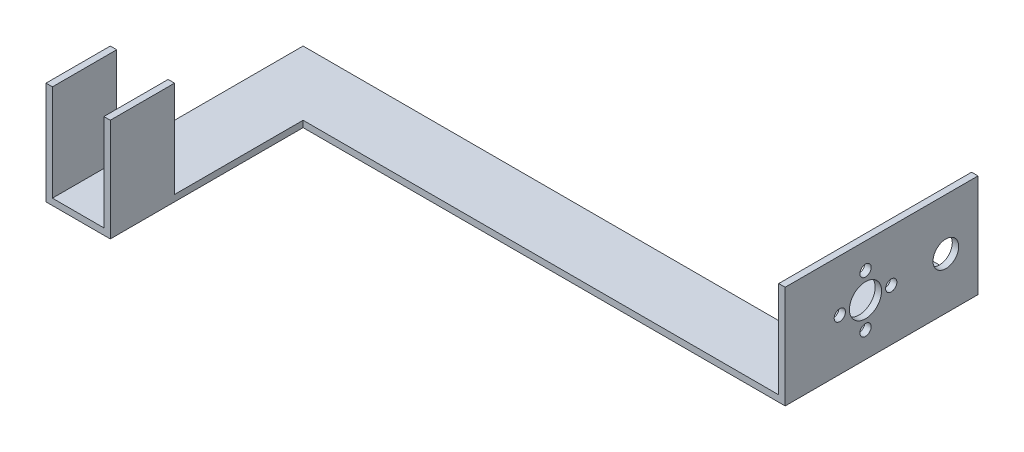
ISO-10303-21;
HEADER;
FILE_DESCRIPTION(('STEP AP214'),'2;1');
FILE_NAME('part.step','',(''),(''),'','','');
FILE_SCHEMA(('AUTOMOTIVE_DESIGN { 1 0 10303 214 1 1 1 1 }'));
ENDSEC;
DATA;
#1=APPLICATION_CONTEXT('core data for automotive mechanical design processes');
#2=APPLICATION_PROTOCOL_DEFINITION('international standard','automotive_design',2000,#1);
#3=PRODUCT_CONTEXT('',#1,'mechanical');
#4=PRODUCT('Part','Part','',(#3));
#5=PRODUCT_RELATED_PRODUCT_CATEGORY('part','',(#4));
#6=PRODUCT_DEFINITION_FORMATION('','',#4);
#7=PRODUCT_DEFINITION_CONTEXT('part definition',#1,'design');
#8=PRODUCT_DEFINITION('design','',#6,#7);
#9=PRODUCT_DEFINITION_SHAPE('','',#8);
#10=(LENGTH_UNIT() NAMED_UNIT(*) SI_UNIT(.MILLI.,.METRE.));
#11=(NAMED_UNIT(*) PLANE_ANGLE_UNIT() SI_UNIT($,.RADIAN.));
#12=(NAMED_UNIT(*) SI_UNIT($,.STERADIAN.) SOLID_ANGLE_UNIT());
#13=UNCERTAINTY_MEASURE_WITH_UNIT(LENGTH_MEASURE(1.E-05),#10,'distance_accuracy_value','');
#14=(GEOMETRIC_REPRESENTATION_CONTEXT(3) GLOBAL_UNCERTAINTY_ASSIGNED_CONTEXT((#13)) GLOBAL_UNIT_ASSIGNED_CONTEXT((#10,
#11,#12)) REPRESENTATION_CONTEXT('',''));
#15=CARTESIAN_POINT('',(0.,0.,0.));
#16=DIRECTION('',(0.,0.,1.));
#17=DIRECTION('',(1.,0.,0.));
#18=AXIS2_PLACEMENT_3D('',#15,#16,#17);
#19=CARTESIAN_POINT('',(0.,2.,0.));
#20=DIRECTION('',(0.,1.,0.));
#21=DIRECTION('',(0.,0.,1.));
#22=AXIS2_PLACEMENT_3D('',#19,#20,#21);
#23=PLANE('',#22);
#24=DIRECTION('',(1.,0.,0.));
#25=VECTOR('',#24,1.);
#26=CARTESIAN_POINT('',(150.,2.,-60.));
#27=LINE('',#26,#25);
#28=CARTESIAN_POINT('',(0.,2.,-60.));
#29=VERTEX_POINT('',#28);
#30=CARTESIAN_POINT('',(148.,2.,-60.));
#31=VERTEX_POINT('',#30);
#32=EDGE_CURVE('E48',#29,#31,#27,.T.);
#33=ORIENTED_EDGE('',*,*,#32,.T.);
#34=DIRECTION('',(0.,0.,1.));
#35=VECTOR('',#34,1.);
#36=CARTESIAN_POINT('',(148.,2.,-120.));
#37=LINE('',#36,#35);
#38=CARTESIAN_POINT('',(148.,2.,-120.));
#39=VERTEX_POINT('',#38);
#40=EDGE_CURVE('E168',#39,#31,#37,.T.);
#41=ORIENTED_EDGE('',*,*,#40,.F.);
#42=DIRECTION('',(-1.,0.,0.));
#43=VECTOR('',#42,1.);
#44=CARTESIAN_POINT('',(130.,2.,-120.));
#45=LINE('',#44,#43);
#46=CARTESIAN_POINT('',(130.,2.,-120.));
#47=VERTEX_POINT('',#46);
#48=EDGE_CURVE('E229',#39,#47,#45,.T.);
#49=ORIENTED_EDGE('',*,*,#48,.T.);
#50=DIRECTION('',(0.,0.,1.));
#51=VECTOR('',#50,1.);
#52=CARTESIAN_POINT('',(130.,2.,-80.));
#53=LINE('',#52,#51);
#54=CARTESIAN_POINT('',(130.,2.,-80.));
#55=VERTEX_POINT('',#54);
#56=EDGE_CURVE('E232',#47,#55,#53,.T.);
#57=ORIENTED_EDGE('',*,*,#56,.T.);
#58=DIRECTION('',(-1.,0.,0.));
#59=VECTOR('',#58,1.);
#60=CARTESIAN_POINT('',(-20.,2.,-80.));
#61=LINE('',#60,#59);
#62=CARTESIAN_POINT('',(-20.,2.,-80.));
#63=VERTEX_POINT('',#62);
#64=EDGE_CURVE('E234',#55,#63,#61,.T.);
#65=ORIENTED_EDGE('',*,*,#64,.T.);
#66=DIRECTION('',(0.,0.,1.));
#67=VECTOR('',#66,1.);
#68=CARTESIAN_POINT('',(-20.,2.,0.));
#69=LINE('',#68,#67);
#70=CARTESIAN_POINT('',(-20.,2.,-20.));
#71=VERTEX_POINT('',#70);
#72=EDGE_CURVE('E236',#63,#71,#69,.T.);
#73=ORIENTED_EDGE('',*,*,#72,.T.);
#74=DIRECTION('',(-1.,0.,0.));
#75=VECTOR('',#74,1.);
#76=CARTESIAN_POINT('',(-20.,2.,-20.));
#77=LINE('',#76,#75);
#78=CARTESIAN_POINT('',(-18.,2.,-20.));
#79=VERTEX_POINT('',#78);
#80=EDGE_CURVE('E208',#79,#71,#77,.T.);
#81=ORIENTED_EDGE('',*,*,#80,.F.);
#82=DIRECTION('',(0.,0.,-1.));
#83=VECTOR('',#82,1.);
#84=CARTESIAN_POINT('',(-18.,2.,-20.));
#85=LINE('',#84,#83);
#86=CARTESIAN_POINT('',(-18.,2.,0.));
#87=VERTEX_POINT('',#86);
#88=EDGE_CURVE('E203',#87,#79,#85,.T.);
#89=ORIENTED_EDGE('',*,*,#88,.F.);
#90=DIRECTION('',(1.,0.,0.));
#91=VECTOR('',#90,1.);
#92=CARTESIAN_POINT('',(0.,2.,0.));
#93=LINE('',#92,#91);
#94=CARTESIAN_POINT('',(-2.,2.,0.));
#95=VERTEX_POINT('',#94);
#96=EDGE_CURVE('E238',#87,#95,#93,.T.);
#97=ORIENTED_EDGE('',*,*,#96,.T.);
#98=DIRECTION('',(0.,0.,1.));
#99=VECTOR('',#98,1.);
#100=CARTESIAN_POINT('',(-2.,2.,-20.));
#101=LINE('',#100,#99);
#102=CARTESIAN_POINT('',(-2.,2.,-20.));
#103=VERTEX_POINT('',#102);
#104=EDGE_CURVE('E182',#103,#95,#101,.T.);
#105=ORIENTED_EDGE('',*,*,#104,.F.);
#106=DIRECTION('',(-1.,0.,0.));
#107=VECTOR('',#106,1.);
#108=CARTESIAN_POINT('',(0.,2.,-20.));
#109=LINE('',#108,#107);
#110=CARTESIAN_POINT('',(0.,2.,-20.));
#111=VERTEX_POINT('',#110);
#112=EDGE_CURVE('E187',#111,#103,#109,.T.);
#113=ORIENTED_EDGE('',*,*,#112,.F.);
#114=DIRECTION('',(0.,0.,-1.));
#115=VECTOR('',#114,1.);
#116=CARTESIAN_POINT('',(0.,2.,-60.));
#117=LINE('',#116,#115);
#118=EDGE_CURVE('E241',#111,#29,#117,.T.);
#119=ORIENTED_EDGE('',*,*,#118,.T.);
#120=EDGE_LOOP('',(#33,#41,#49,#57,#65,#73,#81,#89,#97,#105,#113,#119));
#121=FACE_BOUND('',#120,.T.);
#122=ADVANCED_FACE('F33',(#121),#23,.T.);
#123=CARTESIAN_POINT('',(150.,2.,-60.));
#124=DIRECTION('',(0.,0.,-1.));
#125=DIRECTION('',(-1.,0.,0.));
#126=AXIS2_PLACEMENT_3D('',#123,#124,#125);
#127=PLANE('',#126);
#128=DIRECTION('',(1.,0.,0.));
#129=VECTOR('',#128,1.);
#130=CARTESIAN_POINT('',(150.,0.,-60.));
#131=LINE('',#130,#129);
#132=CARTESIAN_POINT('',(0.,0.,-60.));
#133=VERTEX_POINT('',#132);
#134=CARTESIAN_POINT('',(150.,0.,-60.));
#135=VERTEX_POINT('',#134);
#136=EDGE_CURVE('E154',#133,#135,#131,.T.);
#137=ORIENTED_EDGE('',*,*,#136,.T.);
#138=DIRECTION('',(0.,-1.,0.));
#139=VECTOR('',#138,1.);
#140=CARTESIAN_POINT('',(150.,2.,-60.));
#141=LINE('',#140,#139);
#142=CARTESIAN_POINT('',(150.,32.,-60.));
#143=VERTEX_POINT('',#142);
#144=EDGE_CURVE('E11',#143,#135,#141,.T.);
#145=ORIENTED_EDGE('',*,*,#144,.F.);
#146=DIRECTION('',(1.,0.,0.));
#147=VECTOR('',#146,1.);
#148=CARTESIAN_POINT('',(148.,32.,-60.));
#149=LINE('',#148,#147);
#150=CARTESIAN_POINT('',(148.,32.,-60.));
#151=VERTEX_POINT('',#150);
#152=EDGE_CURVE('E151',#151,#143,#149,.T.);
#153=ORIENTED_EDGE('',*,*,#152,.F.);
#154=DIRECTION('',(0.,-1.,0.));
#155=VECTOR('',#154,1.);
#156=CARTESIAN_POINT('',(148.,32.,-60.));
#157=LINE('',#156,#155);
#158=EDGE_CURVE('E176',#151,#31,#157,.T.);
#159=ORIENTED_EDGE('',*,*,#158,.T.);
#160=ORIENTED_EDGE('',*,*,#32,.F.);
#161=DIRECTION('',(0.,-1.,0.));
#162=VECTOR('',#161,1.);
#163=CARTESIAN_POINT('',(0.,2.,-60.));
#164=LINE('',#163,#162);
#165=EDGE_CURVE('E243',#29,#133,#164,.T.);
#166=ORIENTED_EDGE('',*,*,#165,.T.);
#167=EDGE_LOOP('',(#137,#145,#153,#159,#160,#166));
#168=FACE_BOUND('',#167,.T.);
#169=ADVANCED_FACE('F35',(#168),#127,.F.);
#170=CARTESIAN_POINT('',(150.,2.,-120.));
#171=DIRECTION('',(-1.,0.,0.));
#172=DIRECTION('',(0.,0.,1.));
#173=AXIS2_PLACEMENT_3D('',#170,#171,#172);
#174=PLANE('',#173);
#175=CARTESIAN_POINT('',(150.,16.,-110.));
#176=DIRECTION('',(1.,0.,0.));
#177=DIRECTION('',(0.,0.,-1.));
#178=AXIS2_PLACEMENT_3D('',#175,#176,#177);
#179=CIRCLE('',#178,4.00000000000001);
#180=CARTESIAN_POINT('',(150.,16.,-114.));
#181=VERTEX_POINT('',#180);
#182=EDGE_CURVE('E360',#181,#181,#179,.T.);
#183=ORIENTED_EDGE('',*,*,#182,.F.);
#184=EDGE_LOOP('',(#183));
#185=FACE_BOUND('',#184,.T.);
#186=CARTESIAN_POINT('',(150.,24.,-85.));
#187=DIRECTION('',(1.,0.,0.));
#188=DIRECTION('',(0.,0.,-1.));
#189=AXIS2_PLACEMENT_3D('',#186,#187,#188);
#190=CIRCLE('',#189,1.75);
#191=CARTESIAN_POINT('',(150.,24.,-86.75));
#192=VERTEX_POINT('',#191);
#193=EDGE_CURVE('E364',#192,#192,#190,.T.);
#194=ORIENTED_EDGE('',*,*,#193,.F.);
#195=EDGE_LOOP('',(#194));
#196=FACE_BOUND('',#195,.T.);
#197=CARTESIAN_POINT('',(150.,16.,-93.));
#198=DIRECTION('',(1.,0.,0.));
#199=DIRECTION('',(0.,0.,-1.));
#200=AXIS2_PLACEMENT_3D('',#197,#198,#199);
#201=CIRCLE('',#200,1.75);
#202=CARTESIAN_POINT('',(150.,16.,-94.75));
#203=VERTEX_POINT('',#202);
#204=EDGE_CURVE('E368',#203,#203,#201,.T.);
#205=ORIENTED_EDGE('',*,*,#204,.F.);
#206=EDGE_LOOP('',(#205));
#207=FACE_BOUND('',#206,.T.);
#208=CARTESIAN_POINT('',(150.,7.99999999999999,-85.));
#209=DIRECTION('',(1.,0.,0.));
#210=DIRECTION('',(0.,0.,-1.));
#211=AXIS2_PLACEMENT_3D('',#208,#209,#210);
#212=CIRCLE('',#211,1.74999999999998);
#213=CARTESIAN_POINT('',(150.,7.99999999999999,-86.75));
#214=VERTEX_POINT('',#213);
#215=EDGE_CURVE('E372',#214,#214,#212,.T.);
#216=ORIENTED_EDGE('',*,*,#215,.F.);
#217=EDGE_LOOP('',(#216));
#218=FACE_BOUND('',#217,.T.);
#219=CARTESIAN_POINT('',(150.,16.,-77.));
#220=DIRECTION('',(1.,0.,0.));
#221=DIRECTION('',(0.,0.,-1.));
#222=AXIS2_PLACEMENT_3D('',#219,#220,#221);
#223=CIRCLE('',#222,1.74999999999997);
#224=CARTESIAN_POINT('',(150.,16.,-78.75));
#225=VERTEX_POINT('',#224);
#226=EDGE_CURVE('E376',#225,#225,#223,.T.);
#227=ORIENTED_EDGE('',*,*,#226,.F.);
#228=EDGE_LOOP('',(#227));
#229=FACE_BOUND('',#228,.T.);
#230=CARTESIAN_POINT('',(150.,16.,-85.));
#231=DIRECTION('',(1.,0.,0.));
#232=DIRECTION('',(0.,0.,-1.));
#233=AXIS2_PLACEMENT_3D('',#230,#231,#232);
#234=CIRCLE('',#233,5.);
#235=CARTESIAN_POINT('',(150.,16.,-90.));
#236=VERTEX_POINT('',#235);
#237=EDGE_CURVE('E379',#236,#236,#234,.T.);
#238=ORIENTED_EDGE('',*,*,#237,.F.);
#239=EDGE_LOOP('',(#238));
#240=FACE_BOUND('',#239,.T.);
#241=DIRECTION('',(0.,0.,-1.));
#242=VECTOR('',#241,1.);
#243=CARTESIAN_POINT('',(150.,0.,-120.));
#244=LINE('',#243,#242);
#245=CARTESIAN_POINT('',(150.,0.,-120.));
#246=VERTEX_POINT('',#245);
#247=EDGE_CURVE('E245',#135,#246,#244,.T.);
#248=ORIENTED_EDGE('',*,*,#247,.T.);
#249=DIRECTION('',(0.,-1.,0.));
#250=VECTOR('',#249,1.);
#251=CARTESIAN_POINT('',(150.,2.,-120.));
#252=LINE('',#251,#250);
#253=CARTESIAN_POINT('',(150.,32.,-120.));
#254=VERTEX_POINT('',#253);
#255=EDGE_CURVE('E41',#254,#246,#252,.T.);
#256=ORIENTED_EDGE('',*,*,#255,.F.);
#257=DIRECTION('',(0.,0.,-1.));
#258=VECTOR('',#257,1.);
#259=CARTESIAN_POINT('',(150.,32.,-60.));
#260=LINE('',#259,#258);
#261=EDGE_CURVE('E157',#143,#254,#260,.T.);
#262=ORIENTED_EDGE('',*,*,#261,.F.);
#263=ORIENTED_EDGE('',*,*,#144,.T.);
#264=EDGE_LOOP('',(#248,#256,#262,#263));
#265=FACE_BOUND('',#264,.T.);
#266=ADVANCED_FACE('F158',(#185,#196,#207,#218,#229,#240,#265),#174,.F.);
#267=CARTESIAN_POINT('',(130.,2.,-120.));
#268=DIRECTION('',(0.,0.,1.));
#269=DIRECTION('',(1.,0.,0.));
#270=AXIS2_PLACEMENT_3D('',#267,#268,#269);
#271=PLANE('',#270);
#272=DIRECTION('',(-1.,0.,0.));
#273=VECTOR('',#272,1.);
#274=CARTESIAN_POINT('',(130.,0.,-120.));
#275=LINE('',#274,#273);
#276=CARTESIAN_POINT('',(130.,0.,-120.));
#277=VERTEX_POINT('',#276);
#278=EDGE_CURVE('E247',#246,#277,#275,.T.);
#279=ORIENTED_EDGE('',*,*,#278,.T.);
#280=DIRECTION('',(0.,-1.,0.));
#281=VECTOR('',#280,1.);
#282=CARTESIAN_POINT('',(130.,2.,-120.));
#283=LINE('',#282,#281);
#284=EDGE_CURVE('E271',#47,#277,#283,.T.);
#285=ORIENTED_EDGE('',*,*,#284,.F.);
#286=ORIENTED_EDGE('',*,*,#48,.F.);
#287=DIRECTION('',(0.,-1.,0.));
#288=VECTOR('',#287,1.);
#289=CARTESIAN_POINT('',(148.,32.,-120.));
#290=LINE('',#289,#288);
#291=CARTESIAN_POINT('',(148.,32.,-120.));
#292=VERTEX_POINT('',#291);
#293=EDGE_CURVE('E179',#292,#39,#290,.T.);
#294=ORIENTED_EDGE('',*,*,#293,.F.);
#295=DIRECTION('',(-1.,0.,0.));
#296=VECTOR('',#295,1.);
#297=CARTESIAN_POINT('',(150.,32.,-120.));
#298=LINE('',#297,#296);
#299=EDGE_CURVE('E162',#254,#292,#298,.T.);
#300=ORIENTED_EDGE('',*,*,#299,.F.);
#301=ORIENTED_EDGE('',*,*,#255,.T.);
#302=EDGE_LOOP('',(#279,#285,#286,#294,#300,#301));
#303=FACE_BOUND('',#302,.T.);
#304=ADVANCED_FACE('F275',(#303),#271,.F.);
#305=CARTESIAN_POINT('',(130.,2.,-80.));
#306=DIRECTION('',(1.,0.,0.));
#307=DIRECTION('',(0.,0.,-1.));
#308=AXIS2_PLACEMENT_3D('',#305,#306,#307);
#309=PLANE('',#308);
#310=DIRECTION('',(0.,0.,1.));
#311=VECTOR('',#310,1.);
#312=CARTESIAN_POINT('',(130.,0.,-80.));
#313=LINE('',#312,#311);
#314=CARTESIAN_POINT('',(130.,0.,-80.));
#315=VERTEX_POINT('',#314);
#316=EDGE_CURVE('E249',#277,#315,#313,.T.);
#317=ORIENTED_EDGE('',*,*,#316,.T.);
#318=DIRECTION('',(0.,-1.,0.));
#319=VECTOR('',#318,1.);
#320=CARTESIAN_POINT('',(130.,2.,-80.));
#321=LINE('',#320,#319);
#322=EDGE_CURVE('E268',#55,#315,#321,.T.);
#323=ORIENTED_EDGE('',*,*,#322,.F.);
#324=ORIENTED_EDGE('',*,*,#56,.F.);
#325=ORIENTED_EDGE('',*,*,#284,.T.);
#326=EDGE_LOOP('',(#317,#323,#324,#325));
#327=FACE_BOUND('',#326,.T.);
#328=ADVANCED_FACE('F285',(#327),#309,.F.);
#329=CARTESIAN_POINT('',(-20.,2.,-80.));
#330=DIRECTION('',(0.,0.,1.));
#331=DIRECTION('',(1.,0.,0.));
#332=AXIS2_PLACEMENT_3D('',#329,#330,#331);
#333=PLANE('',#332);
#334=DIRECTION('',(-1.,0.,0.));
#335=VECTOR('',#334,1.);
#336=CARTESIAN_POINT('',(-20.,0.,-80.));
#337=LINE('',#336,#335);
#338=CARTESIAN_POINT('',(-20.,0.,-80.));
#339=VERTEX_POINT('',#338);
#340=EDGE_CURVE('E251',#315,#339,#337,.T.);
#341=ORIENTED_EDGE('',*,*,#340,.T.);
#342=DIRECTION('',(0.,-1.,0.));
#343=VECTOR('',#342,1.);
#344=CARTESIAN_POINT('',(-20.,2.,-80.));
#345=LINE('',#344,#343);
#346=EDGE_CURVE('E265',#63,#339,#345,.T.);
#347=ORIENTED_EDGE('',*,*,#346,.F.);
#348=ORIENTED_EDGE('',*,*,#64,.F.);
#349=ORIENTED_EDGE('',*,*,#322,.T.);
#350=EDGE_LOOP('',(#341,#347,#348,#349));
#351=FACE_BOUND('',#350,.T.);
#352=ADVANCED_FACE('F289',(#351),#333,.F.);
#353=CARTESIAN_POINT('',(-20.,2.,0.));
#354=DIRECTION('',(1.,0.,0.));
#355=DIRECTION('',(0.,0.,-1.));
#356=AXIS2_PLACEMENT_3D('',#353,#354,#355);
#357=PLANE('',#356);
#358=DIRECTION('',(0.,0.,1.));
#359=VECTOR('',#358,1.);
#360=CARTESIAN_POINT('',(-20.,0.,0.));
#361=LINE('',#360,#359);
#362=CARTESIAN_POINT('',(-20.,0.,0.));
#363=VERTEX_POINT('',#362);
#364=EDGE_CURVE('E253',#339,#363,#361,.T.);
#365=ORIENTED_EDGE('',*,*,#364,.T.);
#366=DIRECTION('',(0.,-1.,0.));
#367=VECTOR('',#366,1.);
#368=CARTESIAN_POINT('',(-20.,2.,0.));
#369=LINE('',#368,#367);
#370=CARTESIAN_POINT('',(-20.,32.,0.));
#371=VERTEX_POINT('',#370);
#372=EDGE_CURVE('E262',#371,#363,#369,.T.);
#373=ORIENTED_EDGE('',*,*,#372,.F.);
#374=DIRECTION('',(0.,0.,1.));
#375=VECTOR('',#374,1.);
#376=CARTESIAN_POINT('',(-20.,32.,0.));
#377=LINE('',#376,#375);
#378=CARTESIAN_POINT('',(-20.,32.,-20.));
#379=VERTEX_POINT('',#378);
#380=EDGE_CURVE('E212',#379,#371,#377,.T.);
#381=ORIENTED_EDGE('',*,*,#380,.F.);
#382=DIRECTION('',(0.,-1.,0.));
#383=VECTOR('',#382,1.);
#384=CARTESIAN_POINT('',(-20.,32.,-20.));
#385=LINE('',#384,#383);
#386=EDGE_CURVE('E215',#379,#71,#385,.T.);
#387=ORIENTED_EDGE('',*,*,#386,.T.);
#388=ORIENTED_EDGE('',*,*,#72,.F.);
#389=ORIENTED_EDGE('',*,*,#346,.T.);
#390=EDGE_LOOP('',(#365,#373,#381,#387,#388,#389));
#391=FACE_BOUND('',#390,.T.);
#392=ADVANCED_FACE('F322',(#391),#357,.F.);
#393=CARTESIAN_POINT('',(0.,2.,0.));
#394=DIRECTION('',(0.,0.,-1.));
#395=DIRECTION('',(-1.,0.,0.));
#396=AXIS2_PLACEMENT_3D('',#393,#394,#395);
#397=PLANE('',#396);
#398=DIRECTION('',(1.,0.,0.));
#399=VECTOR('',#398,1.);
#400=CARTESIAN_POINT('',(0.,0.,0.));
#401=LINE('',#400,#399);
#402=CARTESIAN_POINT('',(0.,0.,0.));
#403=VERTEX_POINT('',#402);
#404=EDGE_CURVE('E255',#363,#403,#401,.T.);
#405=ORIENTED_EDGE('',*,*,#404,.T.);
#406=DIRECTION('',(0.,-1.,0.));
#407=VECTOR('',#406,1.);
#408=CARTESIAN_POINT('',(0.,2.,0.));
#409=LINE('',#408,#407);
#410=CARTESIAN_POINT('',(0.,32.,0.));
#411=VERTEX_POINT('',#410);
#412=EDGE_CURVE('E259',#411,#403,#409,.T.);
#413=ORIENTED_EDGE('',*,*,#412,.F.);
#414=DIRECTION('',(1.,0.,0.));
#415=VECTOR('',#414,1.);
#416=CARTESIAN_POINT('',(-2.,32.,0.));
#417=LINE('',#416,#415);
#418=CARTESIAN_POINT('',(-2.,32.,0.));
#419=VERTEX_POINT('',#418);
#420=EDGE_CURVE('E186',#419,#411,#417,.T.);
#421=ORIENTED_EDGE('',*,*,#420,.F.);
#422=DIRECTION('',(0.,-1.,0.));
#423=VECTOR('',#422,1.);
#424=CARTESIAN_POINT('',(-2.,32.,0.));
#425=LINE('',#424,#423);
#426=EDGE_CURVE('E201',#419,#95,#425,.T.);
#427=ORIENTED_EDGE('',*,*,#426,.T.);
#428=ORIENTED_EDGE('',*,*,#96,.F.);
#429=DIRECTION('',(0.,-1.,0.));
#430=VECTOR('',#429,1.);
#431=CARTESIAN_POINT('',(-18.,32.,0.));
#432=LINE('',#431,#430);
#433=CARTESIAN_POINT('',(-18.,32.,0.));
#434=VERTEX_POINT('',#433);
#435=EDGE_CURVE('E225',#434,#87,#432,.T.);
#436=ORIENTED_EDGE('',*,*,#435,.F.);
#437=DIRECTION('',(1.,0.,0.));
#438=VECTOR('',#437,1.);
#439=CARTESIAN_POINT('',(-18.,32.,0.));
#440=LINE('',#439,#438);
#441=EDGE_CURVE('E204',#371,#434,#440,.T.);
#442=ORIENTED_EDGE('',*,*,#441,.F.);
#443=ORIENTED_EDGE('',*,*,#372,.T.);
#444=EDGE_LOOP('',(#405,#413,#421,#427,#428,#436,#442,#443));
#445=FACE_BOUND('',#444,.T.);
#446=ADVANCED_FACE('F302',(#445),#397,.F.);
#447=CARTESIAN_POINT('',(0.,2.,-60.));
#448=DIRECTION('',(-1.,0.,0.));
#449=DIRECTION('',(0.,0.,1.));
#450=AXIS2_PLACEMENT_3D('',#447,#448,#449);
#451=PLANE('',#450);
#452=DIRECTION('',(0.,0.,-1.));
#453=VECTOR('',#452,1.);
#454=CARTESIAN_POINT('',(0.,0.,-60.));
#455=LINE('',#454,#453);
#456=EDGE_CURVE('E230',#403,#133,#455,.T.);
#457=ORIENTED_EDGE('',*,*,#456,.T.);
#458=ORIENTED_EDGE('',*,*,#165,.F.);
#459=ORIENTED_EDGE('',*,*,#118,.F.);
#460=DIRECTION('',(0.,-1.,0.));
#461=VECTOR('',#460,1.);
#462=CARTESIAN_POINT('',(0.,32.,-20.));
#463=LINE('',#462,#461);
#464=CARTESIAN_POINT('',(0.,32.,-20.));
#465=VERTEX_POINT('',#464);
#466=EDGE_CURVE('E56',#465,#111,#463,.T.);
#467=ORIENTED_EDGE('',*,*,#466,.F.);
#468=DIRECTION('',(0.,0.,-1.));
#469=VECTOR('',#468,1.);
#470=CARTESIAN_POINT('',(0.,32.,0.));
#471=LINE('',#470,#469);
#472=EDGE_CURVE('E190',#411,#465,#471,.T.);
#473=ORIENTED_EDGE('',*,*,#472,.F.);
#474=ORIENTED_EDGE('',*,*,#412,.T.);
#475=EDGE_LOOP('',(#457,#458,#459,#467,#473,#474));
#476=FACE_BOUND('',#475,.T.);
#477=ADVANCED_FACE('F299',(#476),#451,.F.);
#478=CARTESIAN_POINT('',(0.,0.,0.));
#479=DIRECTION('',(0.,1.,0.));
#480=DIRECTION('',(0.,0.,1.));
#481=AXIS2_PLACEMENT_3D('',#478,#479,#480);
#482=PLANE('',#481);
#483=ORIENTED_EDGE('',*,*,#136,.F.);
#484=ORIENTED_EDGE('',*,*,#456,.F.);
#485=ORIENTED_EDGE('',*,*,#404,.F.);
#486=ORIENTED_EDGE('',*,*,#364,.F.);
#487=ORIENTED_EDGE('',*,*,#340,.F.);
#488=ORIENTED_EDGE('',*,*,#316,.F.);
#489=ORIENTED_EDGE('',*,*,#278,.F.);
#490=ORIENTED_EDGE('',*,*,#247,.F.);
#491=EDGE_LOOP('',(#483,#484,#485,#486,#487,#488,#489,#490));
#492=FACE_BOUND('',#491,.T.);
#493=ADVANCED_FACE('F280',(#492),#482,.F.);
#494=CARTESIAN_POINT('',(-18.,32.,-20.));
#495=DIRECTION('',(-1.,0.,0.));
#496=DIRECTION('',(0.,0.,1.));
#497=AXIS2_PLACEMENT_3D('',#494,#495,#496);
#498=PLANE('',#497);
#499=ORIENTED_EDGE('',*,*,#88,.T.);
#500=DIRECTION('',(0.,-1.,0.));
#501=VECTOR('',#500,1.);
#502=CARTESIAN_POINT('',(-18.,32.,-20.));
#503=LINE('',#502,#501);
#504=CARTESIAN_POINT('',(-18.,32.,-20.));
#505=VERTEX_POINT('',#504);
#506=EDGE_CURVE('E222',#505,#79,#503,.T.);
#507=ORIENTED_EDGE('',*,*,#506,.F.);
#508=DIRECTION('',(0.,0.,-1.));
#509=VECTOR('',#508,1.);
#510=CARTESIAN_POINT('',(-18.,32.,-20.));
#511=LINE('',#510,#509);
#512=EDGE_CURVE('E207',#434,#505,#511,.T.);
#513=ORIENTED_EDGE('',*,*,#512,.F.);
#514=ORIENTED_EDGE('',*,*,#435,.T.);
#515=EDGE_LOOP('',(#499,#507,#513,#514));
#516=FACE_BOUND('',#515,.T.);
#517=ADVANCED_FACE('F315',(#516),#498,.F.);
#518=CARTESIAN_POINT('',(-20.,32.,-20.));
#519=DIRECTION('',(0.,0.,1.));
#520=DIRECTION('',(1.,0.,0.));
#521=AXIS2_PLACEMENT_3D('',#518,#519,#520);
#522=PLANE('',#521);
#523=ORIENTED_EDGE('',*,*,#80,.T.);
#524=ORIENTED_EDGE('',*,*,#386,.F.);
#525=DIRECTION('',(-1.,0.,0.));
#526=VECTOR('',#525,1.);
#527=CARTESIAN_POINT('',(-20.,32.,-20.));
#528=LINE('',#527,#526);
#529=EDGE_CURVE('E210',#505,#379,#528,.T.);
#530=ORIENTED_EDGE('',*,*,#529,.F.);
#531=ORIENTED_EDGE('',*,*,#506,.T.);
#532=EDGE_LOOP('',(#523,#524,#530,#531));
#533=FACE_BOUND('',#532,.T.);
#534=ADVANCED_FACE('F325',(#533),#522,.F.);
#535=CARTESIAN_POINT('',(0.,32.,0.));
#536=DIRECTION('',(0.,-1.,0.));
#537=DIRECTION('',(0.,0.,-1.));
#538=AXIS2_PLACEMENT_3D('',#535,#536,#537);
#539=PLANE('',#538);
#540=ORIENTED_EDGE('',*,*,#441,.T.);
#541=ORIENTED_EDGE('',*,*,#512,.T.);
#542=ORIENTED_EDGE('',*,*,#529,.T.);
#543=ORIENTED_EDGE('',*,*,#380,.T.);
#544=EDGE_LOOP('',(#540,#541,#542,#543));
#545=FACE_BOUND('',#544,.T.);
#546=ADVANCED_FACE('F319',(#545),#539,.F.);
#547=CARTESIAN_POINT('',(-2.,32.,-20.));
#548=DIRECTION('',(1.,0.,0.));
#549=DIRECTION('',(0.,0.,-1.));
#550=AXIS2_PLACEMENT_3D('',#547,#548,#549);
#551=PLANE('',#550);
#552=ORIENTED_EDGE('',*,*,#104,.T.);
#553=ORIENTED_EDGE('',*,*,#426,.F.);
#554=DIRECTION('',(0.,0.,1.));
#555=VECTOR('',#554,1.);
#556=CARTESIAN_POINT('',(-2.,32.,-20.));
#557=LINE('',#556,#555);
#558=CARTESIAN_POINT('',(-2.,32.,-20.));
#559=VERTEX_POINT('',#558);
#560=EDGE_CURVE('E183',#559,#419,#557,.T.);
#561=ORIENTED_EDGE('',*,*,#560,.F.);
#562=DIRECTION('',(0.,-1.,0.));
#563=VECTOR('',#562,1.);
#564=CARTESIAN_POINT('',(-2.,32.,-20.));
#565=LINE('',#564,#563);
#566=EDGE_CURVE('E194',#559,#103,#565,.T.);
#567=ORIENTED_EDGE('',*,*,#566,.T.);
#568=EDGE_LOOP('',(#552,#553,#561,#567));
#569=FACE_BOUND('',#568,.T.);
#570=ADVANCED_FACE('F309',(#569),#551,.F.);
#571=CARTESIAN_POINT('',(0.,32.,-20.));
#572=DIRECTION('',(0.,0.,1.));
#573=DIRECTION('',(1.,0.,0.));
#574=AXIS2_PLACEMENT_3D('',#571,#572,#573);
#575=PLANE('',#574);
#576=ORIENTED_EDGE('',*,*,#112,.T.);
#577=ORIENTED_EDGE('',*,*,#566,.F.);
#578=DIRECTION('',(-1.,0.,0.));
#579=VECTOR('',#578,1.);
#580=CARTESIAN_POINT('',(0.,32.,-20.));
#581=LINE('',#580,#579);
#582=EDGE_CURVE('E192',#465,#559,#581,.T.);
#583=ORIENTED_EDGE('',*,*,#582,.F.);
#584=ORIENTED_EDGE('',*,*,#466,.T.);
#585=EDGE_LOOP('',(#576,#577,#583,#584));
#586=FACE_BOUND('',#585,.T.);
#587=ADVANCED_FACE('F435',(#586),#575,.F.);
#588=CARTESIAN_POINT('',(0.,32.,0.));
#589=DIRECTION('',(0.,1.,0.));
#590=DIRECTION('',(0.,0.,1.));
#591=AXIS2_PLACEMENT_3D('',#588,#589,#590);
#592=PLANE('',#591);
#593=ORIENTED_EDGE('',*,*,#560,.T.);
#594=ORIENTED_EDGE('',*,*,#420,.T.);
#595=ORIENTED_EDGE('',*,*,#472,.T.);
#596=ORIENTED_EDGE('',*,*,#582,.T.);
#597=EDGE_LOOP('',(#593,#594,#595,#596));
#598=FACE_BOUND('',#597,.T.);
#599=ADVANCED_FACE('F304',(#598),#592,.T.);
#600=CARTESIAN_POINT('',(148.,32.,-120.));
#601=DIRECTION('',(1.,0.,0.));
#602=DIRECTION('',(0.,0.,-1.));
#603=AXIS2_PLACEMENT_3D('',#600,#601,#602);
#604=PLANE('',#603);
#605=CARTESIAN_POINT('',(148.,16.,-110.));
#606=DIRECTION('',(1.,0.,0.));
#607=DIRECTION('',(0.,0.,-1.));
#608=AXIS2_PLACEMENT_3D('',#605,#606,#607);
#609=CIRCLE('',#608,4.00000000000001);
#610=CARTESIAN_POINT('',(148.,16.,-114.));
#611=VERTEX_POINT('',#610);
#612=EDGE_CURVE('E386',#611,#611,#609,.F.);
#613=ORIENTED_EDGE('',*,*,#612,.F.);
#614=EDGE_LOOP('',(#613));
#615=FACE_BOUND('',#614,.T.);
#616=CARTESIAN_POINT('',(148.,24.,-85.));
#617=DIRECTION('',(1.,0.,0.));
#618=DIRECTION('',(0.,0.,-1.));
#619=AXIS2_PLACEMENT_3D('',#616,#617,#618);
#620=CIRCLE('',#619,1.75);
#621=CARTESIAN_POINT('',(148.,24.,-86.75));
#622=VERTEX_POINT('',#621);
#623=EDGE_CURVE('E381',#622,#622,#620,.F.);
#624=ORIENTED_EDGE('',*,*,#623,.F.);
#625=EDGE_LOOP('',(#624));
#626=FACE_BOUND('',#625,.T.);
#627=CARTESIAN_POINT('',(148.,16.,-93.));
#628=DIRECTION('',(1.,0.,0.));
#629=DIRECTION('',(0.,0.,-1.));
#630=AXIS2_PLACEMENT_3D('',#627,#628,#629);
#631=CIRCLE('',#630,1.75);
#632=CARTESIAN_POINT('',(148.,16.,-94.75));
#633=VERTEX_POINT('',#632);
#634=EDGE_CURVE('E390',#633,#633,#631,.F.);
#635=ORIENTED_EDGE('',*,*,#634,.F.);
#636=EDGE_LOOP('',(#635));
#637=FACE_BOUND('',#636,.T.);
#638=CARTESIAN_POINT('',(148.,7.99999999999999,-85.));
#639=DIRECTION('',(1.,0.,0.));
#640=DIRECTION('',(0.,0.,-1.));
#641=AXIS2_PLACEMENT_3D('',#638,#639,#640);
#642=CIRCLE('',#641,1.74999999999998);
#643=CARTESIAN_POINT('',(148.,7.99999999999999,-86.75));
#644=VERTEX_POINT('',#643);
#645=EDGE_CURVE('E393',#644,#644,#642,.F.);
#646=ORIENTED_EDGE('',*,*,#645,.F.);
#647=EDGE_LOOP('',(#646));
#648=FACE_BOUND('',#647,.T.);
#649=CARTESIAN_POINT('',(148.,16.,-77.));
#650=DIRECTION('',(1.,0.,0.));
#651=DIRECTION('',(0.,0.,-1.));
#652=AXIS2_PLACEMENT_3D('',#649,#650,#651);
#653=CIRCLE('',#652,1.74999999999997);
#654=CARTESIAN_POINT('',(148.,16.,-78.75));
#655=VERTEX_POINT('',#654);
#656=EDGE_CURVE('E396',#655,#655,#653,.F.);
#657=ORIENTED_EDGE('',*,*,#656,.F.);
#658=EDGE_LOOP('',(#657));
#659=FACE_BOUND('',#658,.T.);
#660=CARTESIAN_POINT('',(148.,16.,-85.));
#661=DIRECTION('',(1.,0.,0.));
#662=DIRECTION('',(0.,0.,-1.));
#663=AXIS2_PLACEMENT_3D('',#660,#661,#662);
#664=CIRCLE('',#663,5.);
#665=CARTESIAN_POINT('',(148.,16.,-90.));
#666=VERTEX_POINT('',#665);
#667=EDGE_CURVE('E170',#666,#666,#664,.F.);
#668=ORIENTED_EDGE('',*,*,#667,.F.);
#669=EDGE_LOOP('',(#668));
#670=FACE_BOUND('',#669,.T.);
#671=ORIENTED_EDGE('',*,*,#40,.T.);
#672=ORIENTED_EDGE('',*,*,#158,.F.);
#673=DIRECTION('',(0.,0.,1.));
#674=VECTOR('',#673,1.);
#675=CARTESIAN_POINT('',(148.,32.,-120.));
#676=LINE('',#675,#674);
#677=EDGE_CURVE('E166',#292,#151,#676,.T.);
#678=ORIENTED_EDGE('',*,*,#677,.F.);
#679=ORIENTED_EDGE('',*,*,#293,.T.);
#680=EDGE_LOOP('',(#671,#672,#678,#679));
#681=FACE_BOUND('',#680,.T.);
#682=ADVANCED_FACE('F293',(#615,#626,#637,#648,#659,#670,#681),#604,.F.);
#683=CARTESIAN_POINT('',(0.,32.,0.));
#684=DIRECTION('',(0.,1.,0.));
#685=DIRECTION('',(0.,0.,1.));
#686=AXIS2_PLACEMENT_3D('',#683,#684,#685);
#687=PLANE('',#686);
#688=ORIENTED_EDGE('',*,*,#152,.T.);
#689=ORIENTED_EDGE('',*,*,#261,.T.);
#690=ORIENTED_EDGE('',*,*,#299,.T.);
#691=ORIENTED_EDGE('',*,*,#677,.T.);
#692=EDGE_LOOP('',(#688,#689,#690,#691));
#693=FACE_BOUND('',#692,.T.);
#694=ADVANCED_FACE('F164',(#693),#687,.T.);
#695=CARTESIAN_POINT('',(-20.001,16.,-85.));
#696=DIRECTION('',(1.,0.,0.));
#697=DIRECTION('',(0.,0.,-1.));
#698=AXIS2_PLACEMENT_3D('',#695,#696,#697);
#699=CYLINDRICAL_SURFACE('',#698,5.);
#700=ORIENTED_EDGE('',*,*,#237,.T.);
#701=EDGE_LOOP('',(#700));
#702=FACE_BOUND('',#701,.T.);
#703=ORIENTED_EDGE('',*,*,#667,.T.);
#704=EDGE_LOOP('',(#703));
#705=FACE_BOUND('',#704,.T.);
#706=ADVANCED_FACE('F419',(#702,#705),#699,.F.);
#707=CARTESIAN_POINT('',(-20.001,16.,-77.));
#708=DIRECTION('',(1.,0.,0.));
#709=DIRECTION('',(0.,0.,-1.));
#710=AXIS2_PLACEMENT_3D('',#707,#708,#709);
#711=CYLINDRICAL_SURFACE('',#710,1.74999999999997);
#712=ORIENTED_EDGE('',*,*,#226,.T.);
#713=EDGE_LOOP('',(#712));
#714=FACE_BOUND('',#713,.T.);
#715=ORIENTED_EDGE('',*,*,#656,.T.);
#716=EDGE_LOOP('',(#715));
#717=FACE_BOUND('',#716,.T.);
#718=ADVANCED_FACE('F407',(#714,#717),#711,.F.);
#719=CARTESIAN_POINT('',(-20.001,7.99999999999999,-85.));
#720=DIRECTION('',(1.,0.,0.));
#721=DIRECTION('',(0.,0.,-1.));
#722=AXIS2_PLACEMENT_3D('',#719,#720,#721);
#723=CYLINDRICAL_SURFACE('',#722,1.74999999999998);
#724=ORIENTED_EDGE('',*,*,#215,.T.);
#725=EDGE_LOOP('',(#724));
#726=FACE_BOUND('',#725,.T.);
#727=ORIENTED_EDGE('',*,*,#645,.T.);
#728=EDGE_LOOP('',(#727));
#729=FACE_BOUND('',#728,.T.);
#730=ADVANCED_FACE('F403',(#726,#729),#723,.F.);
#731=CARTESIAN_POINT('',(-20.001,16.,-93.));
#732=DIRECTION('',(1.,0.,0.));
#733=DIRECTION('',(0.,0.,-1.));
#734=AXIS2_PLACEMENT_3D('',#731,#732,#733);
#735=CYLINDRICAL_SURFACE('',#734,1.75);
#736=ORIENTED_EDGE('',*,*,#204,.T.);
#737=EDGE_LOOP('',(#736));
#738=FACE_BOUND('',#737,.T.);
#739=ORIENTED_EDGE('',*,*,#634,.T.);
#740=EDGE_LOOP('',(#739));
#741=FACE_BOUND('',#740,.T.);
#742=ADVANCED_FACE('F406',(#738,#741),#735,.F.);
#743=CARTESIAN_POINT('',(-20.001,24.,-85.));
#744=DIRECTION('',(1.,0.,0.));
#745=DIRECTION('',(0.,0.,-1.));
#746=AXIS2_PLACEMENT_3D('',#743,#744,#745);
#747=CYLINDRICAL_SURFACE('',#746,1.75);
#748=ORIENTED_EDGE('',*,*,#193,.T.);
#749=EDGE_LOOP('',(#748));
#750=FACE_BOUND('',#749,.T.);
#751=ORIENTED_EDGE('',*,*,#623,.T.);
#752=EDGE_LOOP('',(#751));
#753=FACE_BOUND('',#752,.T.);
#754=ADVANCED_FACE('F582',(#750,#753),#747,.F.);
#755=CARTESIAN_POINT('',(-20.001,16.,-110.));
#756=DIRECTION('',(1.,0.,0.));
#757=DIRECTION('',(0.,0.,-1.));
#758=AXIS2_PLACEMENT_3D('',#755,#756,#757);
#759=CYLINDRICAL_SURFACE('',#758,4.00000000000001);
#760=ORIENTED_EDGE('',*,*,#182,.T.);
#761=EDGE_LOOP('',(#760));
#762=FACE_BOUND('',#761,.T.);
#763=ORIENTED_EDGE('',*,*,#612,.T.);
#764=EDGE_LOOP('',(#763));
#765=FACE_BOUND('',#764,.T.);
#766=ADVANCED_FACE('F430',(#762,#765),#759,.F.);
#767=CLOSED_SHELL('',(#122,#169,#266,#304,#328,#352,#392,#446,#477,#493,#517,#534,#546,#570,
#587,#599,#682,#694,#706,#718,#730,#742,#754,#766));
#768=MANIFOLD_SOLID_BREP('B2',#767);
#769=ADVANCED_BREP_SHAPE_REPRESENTATION('',(#18,#768),#14);
#770=SHAPE_DEFINITION_REPRESENTATION(#9,#769);
ENDSEC;
END-ISO-10303-21;
